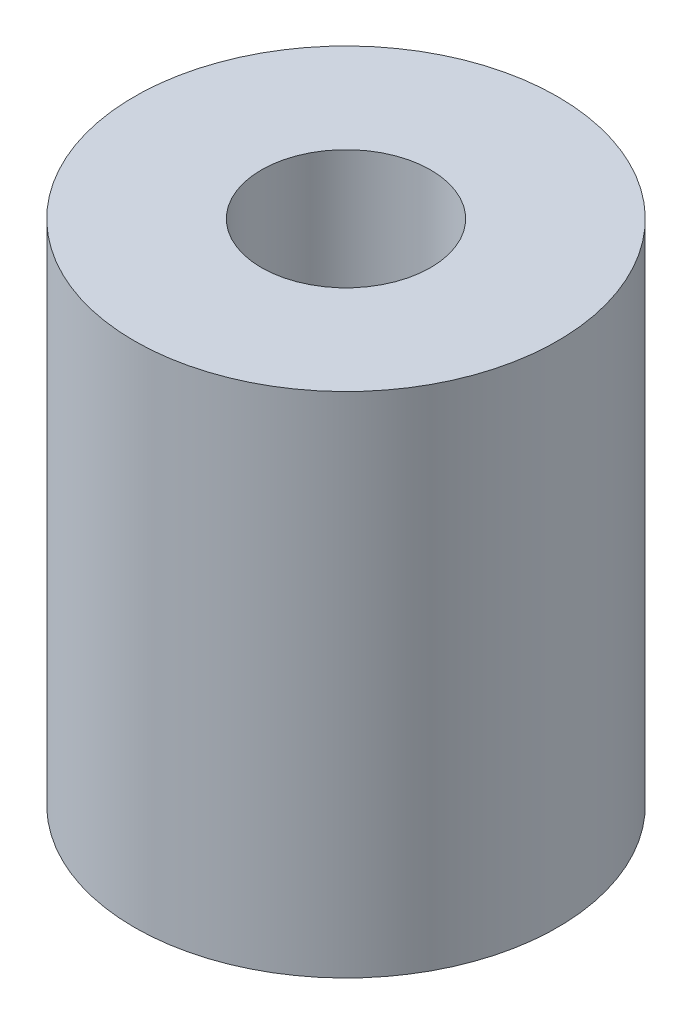
ISO-10303-21;
HEADER;
FILE_DESCRIPTION(('STEP AP214'),'2;1');
FILE_NAME('part.step','',(''),(''),'','','');
FILE_SCHEMA(('AUTOMOTIVE_DESIGN { 1 0 10303 214 1 1 1 1 }'));
ENDSEC;
DATA;
#1=APPLICATION_CONTEXT('core data for automotive mechanical design processes');
#2=APPLICATION_PROTOCOL_DEFINITION('international standard','automotive_design',2000,#1);
#3=PRODUCT_CONTEXT('',#1,'mechanical');
#4=PRODUCT('Part','Part','',(#3));
#5=PRODUCT_RELATED_PRODUCT_CATEGORY('part','',(#4));
#6=PRODUCT_DEFINITION_FORMATION('','',#4);
#7=PRODUCT_DEFINITION_CONTEXT('part definition',#1,'design');
#8=PRODUCT_DEFINITION('design','',#6,#7);
#9=PRODUCT_DEFINITION_SHAPE('','',#8);
#10=(LENGTH_UNIT() NAMED_UNIT(*) SI_UNIT(.MILLI.,.METRE.));
#11=(NAMED_UNIT(*) PLANE_ANGLE_UNIT() SI_UNIT($,.RADIAN.));
#12=(NAMED_UNIT(*) SI_UNIT($,.STERADIAN.) SOLID_ANGLE_UNIT());
#13=UNCERTAINTY_MEASURE_WITH_UNIT(LENGTH_MEASURE(1.E-05),#10,'distance_accuracy_value','');
#14=(GEOMETRIC_REPRESENTATION_CONTEXT(3) GLOBAL_UNCERTAINTY_ASSIGNED_CONTEXT((#13)) GLOBAL_UNIT_ASSIGNED_CONTEXT((#10,
#11,#12)) REPRESENTATION_CONTEXT('',''));
#15=CARTESIAN_POINT('',(0.,0.,0.));
#16=DIRECTION('',(0.,0.,1.));
#17=DIRECTION('',(1.,0.,0.));
#18=AXIS2_PLACEMENT_3D('',#15,#16,#17);
#19=CARTESIAN_POINT('',(0.,30.,0.));
#20=DIRECTION('',(0.,-1.,0.));
#21=DIRECTION('',(0.,0.,-1.));
#22=AXIS2_PLACEMENT_3D('',#19,#20,#21);
#23=CYLINDRICAL_SURFACE('',#22,12.5);
#24=CARTESIAN_POINT('',(0.,30.,0.));
#25=DIRECTION('',(0.,1.,0.));
#26=DIRECTION('',(0.,0.,1.));
#27=AXIS2_PLACEMENT_3D('',#24,#25,#26);
#28=CIRCLE('',#27,12.5);
#29=CARTESIAN_POINT('',(0.,30.,12.5));
#30=VERTEX_POINT('',#29);
#31=EDGE_CURVE('E10',#30,#30,#28,.T.);
#32=ORIENTED_EDGE('',*,*,#31,.F.);
#33=EDGE_LOOP('',(#32));
#34=FACE_BOUND('',#33,.T.);
#35=CARTESIAN_POINT('',(0.,0.,0.));
#36=DIRECTION('',(0.,1.,0.));
#37=DIRECTION('',(0.,0.,1.));
#38=AXIS2_PLACEMENT_3D('',#35,#36,#37);
#39=CIRCLE('',#38,12.5);
#40=CARTESIAN_POINT('',(0.,0.,12.5));
#41=VERTEX_POINT('',#40);
#42=EDGE_CURVE('E38',#41,#41,#39,.T.);
#43=ORIENTED_EDGE('',*,*,#42,.T.);
#44=EDGE_LOOP('',(#43));
#45=FACE_BOUND('',#44,.T.);
#46=ADVANCED_FACE('F31',(#34,#45),#23,.T.);
#47=CARTESIAN_POINT('',(0.,30.,0.));
#48=DIRECTION('',(0.,1.,0.));
#49=DIRECTION('',(0.,0.,1.));
#50=AXIS2_PLACEMENT_3D('',#47,#48,#49);
#51=PLANE('',#50);
#52=CARTESIAN_POINT('',(0.,30.,0.));
#53=DIRECTION('',(0.,1.,0.));
#54=DIRECTION('',(0.,0.,1.));
#55=AXIS2_PLACEMENT_3D('',#52,#53,#54);
#56=CIRCLE('',#55,5.);
#57=CARTESIAN_POINT('',(0.,30.,5.));
#58=VERTEX_POINT('',#57);
#59=EDGE_CURVE('E47',#58,#58,#56,.T.);
#60=ORIENTED_EDGE('',*,*,#59,.F.);
#61=EDGE_LOOP('',(#60));
#62=FACE_BOUND('',#61,.T.);
#63=ORIENTED_EDGE('',*,*,#31,.T.);
#64=EDGE_LOOP('',(#63));
#65=FACE_BOUND('',#64,.T.);
#66=ADVANCED_FACE('F70',(#62,#65),#51,.T.);
#67=CARTESIAN_POINT('',(0.,0.,0.));
#68=DIRECTION('',(0.,1.,0.));
#69=DIRECTION('',(0.,0.,1.));
#70=AXIS2_PLACEMENT_3D('',#67,#68,#69);
#71=PLANE('',#70);
#72=CARTESIAN_POINT('',(0.,0.,0.));
#73=DIRECTION('',(0.,-1.,0.));
#74=DIRECTION('',(0.,0.,-1.));
#75=AXIS2_PLACEMENT_3D('',#72,#73,#74);
#76=CIRCLE('',#75,4.);
#77=CARTESIAN_POINT('',(0.,0.,-4.));
#78=VERTEX_POINT('',#77);
#79=EDGE_CURVE('E50',#78,#78,#76,.T.);
#80=ORIENTED_EDGE('',*,*,#79,.F.);
#81=EDGE_LOOP('',(#80));
#82=FACE_BOUND('',#81,.T.);
#83=ORIENTED_EDGE('',*,*,#42,.F.);
#84=EDGE_LOOP('',(#83));
#85=FACE_BOUND('',#84,.T.);
#86=ADVANCED_FACE('F75',(#82,#85),#71,.F.);
#87=CARTESIAN_POINT('',(0.,15.,0.));
#88=DIRECTION('',(0.,1.,0.));
#89=DIRECTION('',(0.,0.,1.));
#90=AXIS2_PLACEMENT_3D('',#87,#88,#89);
#91=CONICAL_SURFACE('',#90,4.99999999999999,1.02974425867665);
#92=CARTESIAN_POINT('',(0.,14.3991393809724,0.));
#93=DIRECTION('',(0.,1.,0.));
#94=DIRECTION('',(0.,0.,1.));
#95=AXIS2_PLACEMENT_3D('',#92,#93,#94);
#96=CIRCLE('',#95,4.);
#97=CARTESIAN_POINT('',(0.,14.3991393809724,4.));
#98=VERTEX_POINT('',#97);
#99=EDGE_CURVE('E34',#98,#98,#96,.F.);
#100=ORIENTED_EDGE('',*,*,#99,.T.);
#101=EDGE_LOOP('',(#100));
#102=FACE_BOUND('',#101,.T.);
#103=CARTESIAN_POINT('',(0.,15.,0.));
#104=DIRECTION('',(0.,1.,0.));
#105=DIRECTION('',(0.,0.,1.));
#106=AXIS2_PLACEMENT_3D('',#103,#104,#105);
#107=CIRCLE('',#106,4.99999999999999);
#108=CARTESIAN_POINT('',(0.,15.,4.99999999999999));
#109=VERTEX_POINT('',#108);
#110=EDGE_CURVE('E43',#109,#109,#107,.T.);
#111=ORIENTED_EDGE('',*,*,#110,.T.);
#112=EDGE_LOOP('',(#111));
#113=FACE_BOUND('',#112,.T.);
#114=ADVANCED_FACE('F57',(#102,#113),#91,.F.);
#115=CARTESIAN_POINT('',(0.,30.,0.));
#116=DIRECTION('',(0.,1.,0.));
#117=DIRECTION('',(0.,0.,1.));
#118=AXIS2_PLACEMENT_3D('',#115,#116,#117);
#119=CYLINDRICAL_SURFACE('',#118,5.);
#120=ORIENTED_EDGE('',*,*,#110,.F.);
#121=EDGE_LOOP('',(#120));
#122=FACE_BOUND('',#121,.T.);
#123=ORIENTED_EDGE('',*,*,#59,.T.);
#124=EDGE_LOOP('',(#123));
#125=FACE_BOUND('',#124,.T.);
#126=ADVANCED_FACE('F62',(#122,#125),#119,.F.);
#127=CARTESIAN_POINT('',(0.,0.,0.));
#128=DIRECTION('',(0.,-1.,0.));
#129=DIRECTION('',(0.,0.,-1.));
#130=AXIS2_PLACEMENT_3D('',#127,#128,#129);
#131=CYLINDRICAL_SURFACE('',#130,4.);
#132=ORIENTED_EDGE('',*,*,#79,.T.);
#133=EDGE_LOOP('',(#132));
#134=FACE_BOUND('',#133,.T.);
#135=ORIENTED_EDGE('',*,*,#99,.F.);
#136=EDGE_LOOP('',(#135));
#137=FACE_BOUND('',#136,.T.);
#138=ADVANCED_FACE('F60',(#134,#137),#131,.F.);
#139=CLOSED_SHELL('',(#46,#66,#86,#114,#126,#138));
#140=MANIFOLD_SOLID_BREP('B2',#139);
#141=ADVANCED_BREP_SHAPE_REPRESENTATION('',(#18,#140),#14);
#142=SHAPE_DEFINITION_REPRESENTATION(#9,#141);
ENDSEC;
END-ISO-10303-21;
